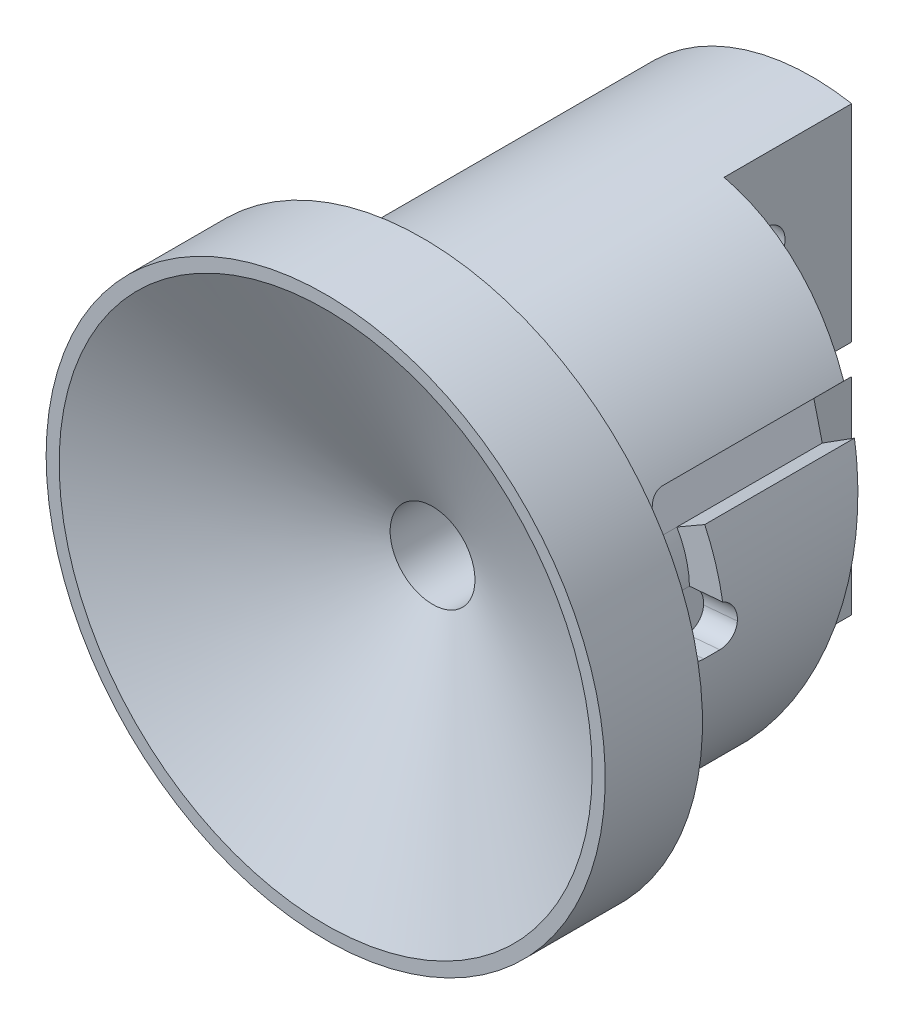
ISO-10303-21;
HEADER;
FILE_DESCRIPTION(('STEP AP214'),'2;1');
FILE_NAME('part.step','',(''),(''),'','','');
FILE_SCHEMA(('AUTOMOTIVE_DESIGN { 1 0 10303 214 1 1 1 1 }'));
ENDSEC;
DATA;
#1=APPLICATION_CONTEXT('core data for automotive mechanical design processes');
#2=APPLICATION_PROTOCOL_DEFINITION('international standard','automotive_design',2000,#1);
#3=PRODUCT_CONTEXT('',#1,'mechanical');
#4=PRODUCT('Part','Part','',(#3));
#5=PRODUCT_RELATED_PRODUCT_CATEGORY('part','',(#4));
#6=PRODUCT_DEFINITION_FORMATION('','',#4);
#7=PRODUCT_DEFINITION_CONTEXT('part definition',#1,'design');
#8=PRODUCT_DEFINITION('design','',#6,#7);
#9=PRODUCT_DEFINITION_SHAPE('','',#8);
#10=(LENGTH_UNIT() NAMED_UNIT(*) SI_UNIT(.MILLI.,.METRE.));
#11=(NAMED_UNIT(*) PLANE_ANGLE_UNIT() SI_UNIT($,.RADIAN.));
#12=(NAMED_UNIT(*) SI_UNIT($,.STERADIAN.) SOLID_ANGLE_UNIT());
#13=UNCERTAINTY_MEASURE_WITH_UNIT(LENGTH_MEASURE(1.E-05),#10,'distance_accuracy_value','');
#14=(GEOMETRIC_REPRESENTATION_CONTEXT(3) GLOBAL_UNCERTAINTY_ASSIGNED_CONTEXT((#13)) GLOBAL_UNIT_ASSIGNED_CONTEXT((#10,
#11,#12)) REPRESENTATION_CONTEXT('',''));
#15=CARTESIAN_POINT('',(0.,0.,0.));
#16=DIRECTION('',(0.,0.,1.));
#17=DIRECTION('',(1.,0.,0.));
#18=AXIS2_PLACEMENT_3D('',#15,#16,#17);
#19=CARTESIAN_POINT('',(12.4163792441114,1.08629242589841,-11.43));
#20=DIRECTION('',(-0.996194698091745,-0.0871557427476648,0.));
#21=DIRECTION('',(0.0871557427476648,-0.996194698091745,0.));
#22=AXIS2_PLACEMENT_3D('',#19,#20,#21);
#23=PLANE('',#22);
#24=DIRECTION('',(0.,0.,1.));
#25=VECTOR('',#24,1.);
#26=CARTESIAN_POINT('',(12.5303876711996,-0.216829858675404,-11.43));
#27=LINE('',#26,#25);
#28=CARTESIAN_POINT('',(12.5303876711996,-0.216829858675404,-11.0477431507776));
#29=VERTEX_POINT('',#28);
#30=CARTESIAN_POINT('',(12.5303876711996,-0.216829858675404,-10.0076));
#31=VERTEX_POINT('',#30);
#32=EDGE_CURVE('E184',#29,#31,#27,.T.);
#33=ORIENTED_EDGE('',*,*,#32,.F.);
#34=CARTESIAN_POINT('',(12.4263411455075,0.972427371906513,-11.0477431507776));
#35=DIRECTION('',(-0.996194698091745,-0.0871557427476648,0.));
#36=DIRECTION('',(0.0871557427476648,-0.996194698091745,0.));
#37=AXIS2_PLACEMENT_3D('',#34,#35,#36);
#38=CIRCLE('',#37,1.1938);
#39=CARTESIAN_POINT('',(12.4417284972035,0.796549137220463,-12.2284160588988));
#40=VERTEX_POINT('',#39);
#41=EDGE_CURVE('E60',#29,#40,#38,.F.);
#42=ORIENTED_EDGE('',*,*,#41,.T.);
#43=CARTESIAN_POINT('',(12.4248678884302,0.989266777355177,-10.9347));
#44=DIRECTION('',(0.996194698091745,0.0871557427476654,0.));
#45=DIRECTION('',(-0.0871557427476654,0.996194698091745,0.));
#46=AXIS2_PLACEMENT_3D('',#43,#44,#45);
#47=CIRCLE('',#46,1.3081);
#48=CARTESIAN_POINT('',(12.3193481056608,2.19536341338579,-11.43));
#49=VERTEX_POINT('',#48);
#50=EDGE_CURVE('E178',#40,#49,#47,.T.);
#51=ORIENTED_EDGE('',*,*,#50,.T.);
#52=DIRECTION('',(0.,0.,-1.));
#53=VECTOR('',#52,1.);
#54=CARTESIAN_POINT('',(12.3193481056608,2.19536341338579,-4.98224669027091));
#55=LINE('',#54,#53);
#56=CARTESIAN_POINT('',(12.3193481056608,2.19536341338579,-8.8138));
#57=VERTEX_POINT('',#56);
#58=EDGE_CURVE('E625',#57,#49,#55,.T.);
#59=ORIENTED_EDGE('',*,*,#58,.F.);
#60=DIRECTION('',(0.0871557427476648,-0.996194698091745,0.));
#61=VECTOR('',#60,1.);
#62=CARTESIAN_POINT('',(12.4163792441114,1.08629242589841,-8.8138));
#63=LINE('',#62,#61);
#64=CARTESIAN_POINT('',(12.4263411455075,0.972427371906522,-8.8138));
#65=VERTEX_POINT('',#64);
#66=EDGE_CURVE('E169',#57,#65,#63,.T.);
#67=ORIENTED_EDGE('',*,*,#66,.T.);
#68=CARTESIAN_POINT('',(12.4263411455075,0.972427371906522,-10.0076));
#69=DIRECTION('',(-0.996194698091745,-0.0871557427476648,0.));
#70=DIRECTION('',(0.0871557427476648,-0.996194698091745,0.));
#71=AXIS2_PLACEMENT_3D('',#68,#69,#70);
#72=CIRCLE('',#71,1.1938);
#73=EDGE_CURVE('E285',#65,#31,#72,.F.);
#74=ORIENTED_EDGE('',*,*,#73,.T.);
#75=EDGE_LOOP('',(#33,#42,#51,#59,#67,#74));
#76=FACE_BOUND('',#75,.T.);
#77=ADVANCED_FACE('F46',(#76),#23,.F.);
#78=CARTESIAN_POINT('',(0.,0.,-0.325495880631441));
#79=DIRECTION('',(0.,0.,-1.));
#80=DIRECTION('',(-1.,0.,0.));
#81=AXIS2_PLACEMENT_3D('',#78,#79,#80);
#82=CYLINDRICAL_SURFACE('',#81,14.6812);
#83=CARTESIAN_POINT('',(0.,0.,-6.35));
#84=DIRECTION('',(0.,0.,-1.));
#85=DIRECTION('',(-1.,0.,0.));
#86=AXIS2_PLACEMENT_3D('',#83,#84,#85);
#87=CIRCLE('',#86,14.6812);
#88=CARTESIAN_POINT('',(-14.6812,0.,-6.35));
#89=VERTEX_POINT('',#88);
#90=EDGE_CURVE('E246',#89,#89,#87,.T.);
#91=ORIENTED_EDGE('',*,*,#90,.T.);
#92=EDGE_LOOP('',(#91));
#93=FACE_BOUND('',#92,.T.);
#94=CARTESIAN_POINT('',(0.,0.,-11.43));
#95=DIRECTION('',(0.,0.,-1.));
#96=DIRECTION('',(-1.,0.,0.));
#97=AXIS2_PLACEMENT_3D('',#94,#95,#96);
#98=CIRCLE('',#97,14.6812);
#99=CARTESIAN_POINT('',(13.3177730257338,6.17855606715985,-11.43));
#100=VERTEX_POINT('',#99);
#101=CARTESIAN_POINT('',(14.4861901964781,2.3849375319831,-11.43));
#102=VERTEX_POINT('',#101);
#103=EDGE_CURVE('E174',#100,#102,#98,.T.);
#104=ORIENTED_EDGE('',*,*,#103,.T.);
#105=CARTESIAN_POINT('',(14.4861901964781,2.3849375319831,-11.43));
#106=CARTESIAN_POINT('',(14.4884613639518,2.37113892146036,-11.4640839324803));
#107=CARTESIAN_POINT('',(14.4909469978515,2.35592163119562,-11.4975599355647));
#108=CARTESIAN_POINT('',(14.4963016066078,2.32274827648895,-11.5630917175754));
#109=CARTESIAN_POINT('',(14.4991705585478,2.30479237576407,-11.5951475812514));
#110=CARTESIAN_POINT('',(14.5082748069592,2.24702314199613,-11.6887851744347));
#111=CARTESIAN_POINT('',(14.5150150036987,2.2032637948891,-11.7479464938295));
#112=CARTESIAN_POINT('',(14.5293750070234,2.10648592639315,-11.8580031221646));
#113=CARTESIAN_POINT('',(14.5369951813185,2.0534635295405,-11.9088949540572));
#114=CARTESIAN_POINT('',(14.5526203993969,1.93963040528132,-12.0009804680014));
#115=CARTESIAN_POINT('',(14.5606253725657,1.87882110346975,-12.0421759213184));
#116=CARTESIAN_POINT('',(14.576537633485,1.75109152865624,-12.1137040439891));
#117=CARTESIAN_POINT('',(14.5844449014716,1.68417004152981,-12.1440345492142));
#118=CARTESIAN_POINT('',(14.5997272511608,1.54609767566489,-12.1929541419579));
#119=CARTESIAN_POINT('',(14.607102277394,1.47494635750507,-12.2115420072372));
#120=CARTESIAN_POINT('',(14.6209501884581,1.33066995216013,-12.2363920347503));
#121=CARTESIAN_POINT('',(14.6274258299262,1.25755175459766,-12.2426926683214));
#122=CARTESIAN_POINT('',(14.6392703996066,1.11120858960278,-12.2429046032492));
#123=CARTESIAN_POINT('',(14.6446393414138,1.03798362349305,-12.2368160568067));
#124=CARTESIAN_POINT('',(14.6541548947385,0.893645242462607,-12.2124528028116));
#125=CARTESIAN_POINT('',(14.6583036793869,0.822528278854515,-12.1941999519649));
#126=CARTESIAN_POINT('',(14.6654071916949,0.684294374417719,-12.1460628447409));
#127=CARTESIAN_POINT('',(14.6683620518004,0.61717699060737,-12.1161798792521));
#128=CARTESIAN_POINT('',(14.6732064954826,0.488666124884252,-12.0455416585469));
#129=CARTESIAN_POINT('',(14.6750933912915,0.427287406482897,-12.0047593487301));
#130=CARTESIAN_POINT('',(14.6779937408499,0.312178358820198,-11.9135124207659));
#131=CARTESIAN_POINT('',(14.6790070080101,0.258449665492134,-11.8630457370473));
#132=CARTESIAN_POINT('',(14.6804218904452,0.159245895251082,-11.7527841678264));
#133=CARTESIAN_POINT('',(14.680811807414,0.113942466276904,-11.692833569748));
#134=CARTESIAN_POINT('',(14.6811136624675,0.0541648994216365,-11.5978162464266));
#135=CARTESIAN_POINT('',(14.6811670302523,0.0355888327049288,-11.5652633572206));
#136=CARTESIAN_POINT('',(14.6812098056202,0.00129355360213024,-11.498683736804));
#137=CARTESIAN_POINT('',(14.6811992098185,-0.014425507549017,-11.4646569276898));
#138=CARTESIAN_POINT('',(14.6811720243797,-0.028660610083196,-11.43));
#139=B_SPLINE_CURVE_WITH_KNOTS('',3,(#105,#106,#107,#108,#109,#110,#111,#112,#113,#114,#115,
#116,#117,#118,#119,#120,#121,#122,#123,#124,#125,#126,#127,#128,#129,#130,#131,#132,#133,#134,
#135,#136,#137,#138),.UNSPECIFIED.,.F.,.F.,(4,2,2,2,2,2,2,2,2,2,2,2,2,2,2,2,4),(0.,
0.110455309405497,0.22090401826105,0.441450437625067,0.662089350884358,0.882687928062333,
1.10333042064266,1.3239958751392,1.5439693094908,1.76394004148966,1.98351659398571,
2.20306878145643,2.42317109112525,2.64332039849976,2.86755466092752,2.97987594788759,
3.09220317881903),.UNSPECIFIED.);
#140=CARTESIAN_POINT('',(14.6478125129356,0.989556479382784,-12.2284160588988));
#141=VERTEX_POINT('',#140);
#142=EDGE_CURVE('E160',#102,#141,#139,.T.);
#143=ORIENTED_EDGE('',*,*,#142,.T.);
#144=CARTESIAN_POINT('',(14.6478125129356,0.989556479382784,-12.2284160588988));
#145=CARTESIAN_POINT('',(14.6500520617752,0.956414885802688,-12.2234497719461));
#146=CARTESIAN_POINT('',(14.6521625740862,0.923490699329103,-12.2170844377252));
#147=CARTESIAN_POINT('',(14.6561266797544,0.858282230564713,-12.2016024279582));
#148=CARTESIAN_POINT('',(14.6579802900503,0.825997906205256,-12.1924859339349));
#149=CARTESIAN_POINT('',(14.6631521672888,0.730511927722907,-12.1611134422584));
#150=CARTESIAN_POINT('',(14.6660889302212,0.668565530487546,-12.1348175692463));
#151=CARTESIAN_POINT('',(14.6710176288004,0.549922268249114,-12.0722187251337));
#152=CARTESIAN_POINT('',(14.6730091760995,0.493227568624937,-12.0359116505367));
#153=CARTESIAN_POINT('',(14.6762031903628,0.38669701296365,-11.9543239944428));
#154=CARTESIAN_POINT('',(14.6774058468479,0.336859511848389,-11.9090455716021));
#155=CARTESIAN_POINT('',(14.6792209558788,0.245374594432259,-11.8106954776694));
#156=CARTESIAN_POINT('',(14.6798323334249,0.203742204744798,-11.7576098133281));
#157=CARTESIAN_POINT('',(14.680671372986,0.129958071030313,-11.6451657160257));
#158=CARTESIAN_POINT('',(14.680898820731,0.0978116293300162,-11.5858037999342));
#159=CARTESIAN_POINT('',(14.6811588607807,0.043971541156054,-11.4625272929247));
#160=CARTESIAN_POINT('',(14.681191469244,0.0222770279981484,-11.3986130799922));
#161=CARTESIAN_POINT('',(14.6812059558936,-0.00998039306510226,-11.268137439148));
#162=CARTESIAN_POINT('',(14.6811879344012,-0.0205652571984908,-11.2015815034751));
#163=CARTESIAN_POINT('',(14.6811735472856,-0.0276040131707234,-11.1057329463568));
#164=CARTESIAN_POINT('',(14.6811706958382,-0.0286684031172335,-11.0767298307041));
#165=CARTESIAN_POINT('',(14.6811720243797,-0.0286606100832027,-11.0477431507776));
#166=B_SPLINE_CURVE_WITH_KNOTS('',3,(#144,#145,#146,#147,#148,#149,#150,#151,#152,#153,#154,
#155,#156,#157,#158,#159,#160,#161,#162,#163,#164,#165),.UNSPECIFIED.,.F.,.F.,(4,2,2,2,2,2,2,2,
2,2,4),(0.,0.100696848378733,0.201387054188759,0.402432056561508,0.603559588185072,
0.804638783804235,1.00608287651422,1.20763935734326,1.40917912203195,1.61031982519953,
1.69730434377564),.UNSPECIFIED.);
#167=CARTESIAN_POINT('',(14.6811720243797,-0.0286606100831969,-11.0477431507776));
#168=VERTEX_POINT('',#167);
#169=EDGE_CURVE('E13',#141,#168,#166,.T.);
#170=ORIENTED_EDGE('',*,*,#169,.T.);
#171=DIRECTION('',(0.,0.,1.));
#172=VECTOR('',#171,1.);
#173=CARTESIAN_POINT('',(14.6811720243797,-0.0286606100831969,-11.43));
#174=LINE('',#173,#172);
#175=CARTESIAN_POINT('',(14.6811720243797,-0.0286606100831969,-10.0076));
#176=VERTEX_POINT('',#175);
#177=EDGE_CURVE('E186',#168,#176,#174,.T.);
#178=ORIENTED_EDGE('',*,*,#177,.T.);
#179=CARTESIAN_POINT('',(14.6811720243797,-0.0286606100831969,-10.0076));
#180=CARTESIAN_POINT('',(14.6811713603819,-0.0286605230438289,-9.97408563546251));
#181=CARTESIAN_POINT('',(14.6811748663989,-0.0272427717737959,-9.94058738885749));
#182=CARTESIAN_POINT('',(14.6811845304353,-0.0215876829205685,-9.8738318693208));
#183=CARTESIAN_POINT('',(14.68119068829,-0.0173505205160749,-9.84057458154739));
#184=CARTESIAN_POINT('',(14.6812045930233,-0.000453664150254155,-9.74159048510479));
#185=CARTESIAN_POINT('',(14.6812078098013,0.0163915308899458,-9.67652869935269));
#186=CARTESIAN_POINT('',(14.6810908383812,0.0607567027563818,-9.55016116036319));
#187=CARTESIAN_POINT('',(14.6809705991541,0.0882810907647501,-9.48885697138397));
#188=CARTESIAN_POINT('',(14.6804363890432,0.153200837694031,-9.37172124193255));
#189=CARTESIAN_POINT('',(14.6800224525708,0.190595039879959,-9.31588906119583));
#190=CARTESIAN_POINT('',(14.6786972688968,0.274281353774743,-9.21113424513901));
#191=CARTESIAN_POINT('',(14.6777848159165,0.320594862330806,-9.16222872618486));
#192=CARTESIAN_POINT('',(14.6752549436024,0.42074894096606,-9.07284954191489));
#193=CARTESIAN_POINT('',(14.6736373854947,0.474590991341006,-9.03237753874161));
#194=CARTESIAN_POINT('',(14.6695155823306,0.588380160054187,-8.96094395595983));
#195=CARTESIAN_POINT('',(14.6670094195741,0.648340280904667,-8.93000321783209));
#196=CARTESIAN_POINT('',(14.6609910764105,0.772547009819359,-8.87865031721457));
#197=CARTESIAN_POINT('',(14.6574795068623,0.836790996991481,-8.85823178273492));
#198=CARTESIAN_POINT('',(14.6507889416689,0.945461627073592,-8.83354305630054));
#199=CARTESIAN_POINT('',(14.6479009496125,0.989221128629121,-8.82614487763141));
#200=CARTESIAN_POINT('',(14.6416949748365,1.07720193868941,-8.81627361018692));
#201=CARTESIAN_POINT('',(14.6383775752617,1.12142254745402,-8.81379391522364));
#202=CARTESIAN_POINT('',(14.6348522499863,1.16564705681955,-8.8138));
#203=B_SPLINE_CURVE_WITH_KNOTS('',3,(#179,#180,#181,#182,#183,#184,#185,#186,#187,#188,#189,
#190,#191,#192,#193,#194,#195,#196,#197,#198,#199,#200,#201,#202),.UNSPECIFIED.,.F.,.F.,(4,2,2,
2,2,2,2,2,2,2,2,4),(0.,0.10048113671173,0.200956030803738,0.401542288075423,0.602211488518851,
0.8028571811141,1.00399034458768,1.20516311152662,1.40677269924674,1.60826005322121,
1.74142420625145,1.87440938039694),.UNSPECIFIED.);
#204=CARTESIAN_POINT('',(14.6348522499863,1.16564705681955,-8.8138));
#205=VERTEX_POINT('',#204);
#206=EDGE_CURVE('E295',#176,#205,#203,.T.);
#207=ORIENTED_EDGE('',*,*,#206,.T.);
#208=CARTESIAN_POINT('',(0.,0.,-8.8138));
#209=DIRECTION('',(0.,0.,-1.));
#210=DIRECTION('',(-1.,0.,0.));
#211=AXIS2_PLACEMENT_3D('',#208,#209,#210);
#212=CIRCLE('',#211,14.6812);
#213=CARTESIAN_POINT('',(12.6567568233372,7.43936423055812,-8.8138));
#214=VERTEX_POINT('',#213);
#215=EDGE_CURVE('E198',#205,#214,#212,.F.);
#216=ORIENTED_EDGE('',*,*,#215,.T.);
#217=CARTESIAN_POINT('',(12.6567568233372,7.43936423055812,-8.8138));
#218=CARTESIAN_POINT('',(12.6397597788737,7.46828295212252,-8.81380015810687));
#219=CARTESIAN_POINT('',(12.6226705774063,7.49712876306233,-8.8152145949507));
#220=CARTESIAN_POINT('',(12.5884195945533,7.55449792981282,-8.82085647503839));
#221=CARTESIAN_POINT('',(12.5712578177808,7.58302130570696,-8.82508374208702));
#222=CARTESIAN_POINT('',(12.5198894231226,7.66774696235313,-8.84194156904666));
#223=CARTESIAN_POINT('',(12.4857380361821,7.72320965707814,-8.8587482841184));
#224=CARTESIAN_POINT('',(12.4187154652752,7.83052717895543,-8.90302146476721));
#225=CARTESIAN_POINT('',(12.3858448136072,7.88238051288315,-8.93049231164126));
#226=CARTESIAN_POINT('',(12.322454656725,7.98111440689049,-8.99530765608452));
#227=CARTESIAN_POINT('',(12.2919348705147,8.02799556154164,-9.03265097123783));
#228=CARTESIAN_POINT('',(12.2342228425561,8.11567569488978,-9.11625205562751));
#229=CARTESIAN_POINT('',(12.2070382409144,8.15646075385226,-9.16252968986431));
#230=CARTESIAN_POINT('',(12.1570375594092,8.23080088923721,-9.26265484131266));
#231=CARTESIAN_POINT('',(12.1342223196209,8.26435457547542,-9.31650381078207));
#232=CARTESIAN_POINT('',(12.0937823150095,8.32342180353166,-9.43031977384777));
#233=CARTESIAN_POINT('',(12.0761645636817,8.34892448453775,-9.49029488857362));
#234=CARTESIAN_POINT('',(12.0468408632733,8.39118133972652,-9.61459598954198));
#235=CARTESIAN_POINT('',(12.0351312922353,8.40794087403206,-9.6789192826759));
#236=CARTESIAN_POINT('',(12.0209857473769,8.4281451550881,-9.7876294569824));
#237=CARTESIAN_POINT('',(12.0167485960115,8.43418213385462,-9.83132608869502));
#238=CARTESIAN_POINT('',(12.0110913581152,8.44223457874028,-9.91920886554014));
#239=CARTESIAN_POINT('',(12.0096674778834,8.44425546059445,-9.96339427054197));
#240=CARTESIAN_POINT('',(12.0096730257338,8.4442517285407,-10.0076));
#241=B_SPLINE_CURVE_WITH_KNOTS('',3,(#217,#218,#219,#220,#221,#222,#223,#224,#225,#226,#227,
#228,#229,#230,#231,#232,#233,#234,#235,#236,#237,#238,#239,#240),.UNSPECIFIED.,.F.,.F.,(4,2,2,
2,2,2,2,2,2,2,2,4),(0.,0.100569590039991,0.201132881010322,0.401899054356789,0.60274779877107,
0.80357249861645,1.00484897434578,1.20616410971808,1.40774967022183,1.6092114998785,
1.74189925108982,1.87440795018741),.UNSPECIFIED.);
#242=CARTESIAN_POINT('',(12.0096730257338,8.4442517285407,-10.0076));
#243=VERTEX_POINT('',#242);
#244=EDGE_CURVE('E288',#214,#243,#241,.T.);
#245=ORIENTED_EDGE('',*,*,#244,.T.);
#246=DIRECTION('',(0.,0.,-1.));
#247=VECTOR('',#246,1.);
#248=CARTESIAN_POINT('',(12.0096730257338,8.4442517285407,-1.79195968761566));
#249=LINE('',#248,#247);
#250=CARTESIAN_POINT('',(12.0096730257338,8.4442517285407,-21.8093523907729));
#251=VERTEX_POINT('',#250);
#252=EDGE_CURVE('E199',#243,#251,#249,.T.);
#253=ORIENTED_EDGE('',*,*,#252,.T.);
#254=CARTESIAN_POINT('',(0.,0.,-19.5467219594253));
#255=DIRECTION('',(0.,0.258819045102522,0.965925826289068));
#256=DIRECTION('',(0.,0.965925826289068,-0.258819045102522));
#257=AXIS2_PLACEMENT_3D('',#254,#255,#256);
#258=ELLIPSE('',#257,15.1990966598365,14.6812);
#259=CARTESIAN_POINT('',(2.5908,14.4507919782966,-23.4188));
#260=VERTEX_POINT('',#259);
#261=EDGE_CURVE('E258',#260,#251,#258,.F.);
#262=ORIENTED_EDGE('',*,*,#261,.F.);
#263=DIRECTION('',(0.,0.,-1.));
#264=VECTOR('',#263,1.);
#265=CARTESIAN_POINT('',(2.5908,14.4507919782966,-23.4188));
#266=LINE('',#265,#264);
#267=CARTESIAN_POINT('',(2.5908,14.4507919782966,-31.75));
#268=VERTEX_POINT('',#267);
#269=EDGE_CURVE('E221',#260,#268,#266,.T.);
#270=ORIENTED_EDGE('',*,*,#269,.T.);
#271=CARTESIAN_POINT('',(0.,0.,-31.75));
#272=DIRECTION('',(0.,0.,-1.));
#273=DIRECTION('',(-1.,0.,0.));
#274=AXIS2_PLACEMENT_3D('',#271,#272,#273);
#275=CIRCLE('',#274,14.6812);
#276=CARTESIAN_POINT('',(2.5908,-14.4507919782966,-31.75));
#277=VERTEX_POINT('',#276);
#278=EDGE_CURVE('E249',#277,#268,#275,.T.);
#279=ORIENTED_EDGE('',*,*,#278,.F.);
#280=DIRECTION('',(0.,0.,1.));
#281=VECTOR('',#280,1.);
#282=CARTESIAN_POINT('',(2.5908,-14.4507919782966,-31.75));
#283=LINE('',#282,#281);
#284=CARTESIAN_POINT('',(2.5908,-14.4507919782966,-15.6746439188506));
#285=VERTEX_POINT('',#284);
#286=EDGE_CURVE('E214',#277,#285,#283,.T.);
#287=ORIENTED_EDGE('',*,*,#286,.T.);
#288=CARTESIAN_POINT('',(13.3177730257338,6.17855606715985,-21.2022610680112));
#289=VERTEX_POINT('',#288);
#290=EDGE_CURVE('E255',#289,#285,#258,.F.);
#291=ORIENTED_EDGE('',*,*,#290,.F.);
#292=DIRECTION('',(0.,0.,-1.));
#293=VECTOR('',#292,1.);
#294=CARTESIAN_POINT('',(13.3177730257338,6.17855606715985,-1.79195968761566));
#295=LINE('',#294,#293);
#296=EDGE_CURVE('E183',#100,#289,#295,.T.);
#297=ORIENTED_EDGE('',*,*,#296,.F.);
#298=EDGE_LOOP('',(#104,#143,#170,#178,#207,#216,#245,#253,#262,#270,#279,#287,#291,#297));
#299=FACE_BOUND('',#298,.T.);
#300=ADVANCED_FACE('F181',(#93,#299),#82,.T.);
#301=CARTESIAN_POINT('',(0.,0.,-11.43));
#302=DIRECTION('',(0.,0.,-1.));
#303=DIRECTION('',(-1.,0.,0.));
#304=AXIS2_PLACEMENT_3D('',#301,#302,#303);
#305=PLANE('',#304);
#306=CARTESIAN_POINT('',(6.18343536424458,2.05954429780938,-11.43));
#307=DIRECTION('',(0.,0.,1.));
#308=DIRECTION('',(1.,0.,0.));
#309=AXIS2_PLACEMENT_3D('',#306,#307,#308);
#310=CIRCLE('',#309,6.13741574300042);
#311=CARTESIAN_POINT('',(11.4985933112695,5.12825216930959,-11.43));
#312=VERTEX_POINT('',#311);
#313=EDGE_CURVE('E177',#49,#312,#310,.T.);
#314=ORIENTED_EDGE('',*,*,#313,.F.);
#315=DIRECTION('',(-0.996194698091745,-0.0871557427476654,0.));
#316=VECTOR('',#315,1.);
#317=CARTESIAN_POINT('',(19.5987713062001,2.8322304204406,-11.43));
#318=LINE('',#317,#316);
#319=EDGE_CURVE('E164',#102,#49,#318,.T.);
#320=ORIENTED_EDGE('',*,*,#319,.F.);
#321=ORIENTED_EDGE('',*,*,#103,.F.);
#322=DIRECTION('',(0.866025403784438,0.500000000000001,0.));
#323=VECTOR('',#322,1.);
#324=CARTESIAN_POINT('',(13.3177730257338,6.17855606715985,-11.43));
#325=LINE('',#324,#323);
#326=EDGE_CURVE('E270',#312,#100,#325,.T.);
#327=ORIENTED_EDGE('',*,*,#326,.F.);
#328=EDGE_LOOP('',(#314,#320,#321,#327));
#329=FACE_BOUND('',#328,.T.);
#330=ADVANCED_FACE('F173',(#329),#305,.F.);
#331=CARTESIAN_POINT('',(0.,0.,-0.325495880631441));
#332=DIRECTION('',(0.,0.,-1.));
#333=DIRECTION('',(-1.,0.,0.));
#334=AXIS2_PLACEMENT_3D('',#331,#332,#333);
#335=CYLINDRICAL_SURFACE('',#334,2.7686);
#336=CARTESIAN_POINT('',(0.,0.,-6.97773967883212));
#337=DIRECTION('',(0.,0.,1.));
#338=DIRECTION('',(1.,0.,0.));
#339=AXIS2_PLACEMENT_3D('',#336,#337,#338);
#340=CIRCLE('',#339,2.7686);
#341=CARTESIAN_POINT('',(2.7686,0.,-6.97773967883212));
#342=VERTEX_POINT('',#341);
#343=EDGE_CURVE('E239',#342,#342,#340,.F.);
#344=ORIENTED_EDGE('',*,*,#343,.F.);
#345=EDGE_LOOP('',(#344));
#346=FACE_BOUND('',#345,.T.);
#347=CARTESIAN_POINT('',(0.,0.,-19.5467219594253));
#348=DIRECTION('',(0.,0.258819045102522,0.965925826289068));
#349=DIRECTION('',(0.,0.965925826289068,-0.258819045102522));
#350=AXIS2_PLACEMENT_3D('',#347,#348,#349);
#351=ELLIPSE('',#350,2.86626563308336,2.7686);
#352=CARTESIAN_POINT('',(2.5908,-0.976166645609243,-19.2851588950561));
#353=VERTEX_POINT('',#352);
#354=CARTESIAN_POINT('',(2.5908,0.976166645609244,-19.8082850237945));
#355=VERTEX_POINT('',#354);
#356=EDGE_CURVE('E234',#353,#355,#351,.T.);
#357=ORIENTED_EDGE('',*,*,#356,.F.);
#358=DIRECTION('',(0.,0.,-1.));
#359=VECTOR('',#358,1.);
#360=CARTESIAN_POINT('',(2.5908,-0.976166645609243,-0.325495880631441));
#361=LINE('',#360,#359);
#362=CARTESIAN_POINT('',(2.5908,-0.976166645609244,-31.75));
#363=VERTEX_POINT('',#362);
#364=EDGE_CURVE('E231',#353,#363,#361,.T.);
#365=ORIENTED_EDGE('',*,*,#364,.T.);
#366=CARTESIAN_POINT('',(0.,0.,-31.75));
#367=DIRECTION('',(0.,0.,-1.));
#368=DIRECTION('',(-1.,0.,0.));
#369=AXIS2_PLACEMENT_3D('',#366,#367,#368);
#370=CIRCLE('',#369,2.7686);
#371=CARTESIAN_POINT('',(2.5908,0.976166645609244,-31.75));
#372=VERTEX_POINT('',#371);
#373=EDGE_CURVE('E252',#363,#372,#370,.T.);
#374=ORIENTED_EDGE('',*,*,#373,.T.);
#375=DIRECTION('',(0.,0.,-1.));
#376=VECTOR('',#375,1.);
#377=CARTESIAN_POINT('',(2.5908,0.976166645609243,-0.325495880631441));
#378=LINE('',#377,#376);
#379=EDGE_CURVE('E228',#372,#355,#378,.F.);
#380=ORIENTED_EDGE('',*,*,#379,.T.);
#381=EDGE_LOOP('',(#357,#365,#374,#380));
#382=FACE_BOUND('',#381,.T.);
#383=ADVANCED_FACE('F318',(#346,#382),#335,.F.);
#384=CARTESIAN_POINT('',(0.,2.7686,-31.75));
#385=DIRECTION('',(0.,0.,-1.));
#386=DIRECTION('',(-1.,0.,0.));
#387=AXIS2_PLACEMENT_3D('',#384,#385,#386);
#388=PLANE('',#387);
#389=ORIENTED_EDGE('',*,*,#278,.T.);
#390=DIRECTION('',(0.,-1.,0.));
#391=VECTOR('',#390,1.);
#392=CARTESIAN_POINT('',(2.5908,14.4507919782966,-31.75));
#393=LINE('',#392,#391);
#394=EDGE_CURVE('E225',#268,#372,#393,.T.);
#395=ORIENTED_EDGE('',*,*,#394,.T.);
#396=ORIENTED_EDGE('',*,*,#373,.F.);
#397=EDGE_CURVE('E224',#363,#277,#393,.T.);
#398=ORIENTED_EDGE('',*,*,#397,.T.);
#399=EDGE_LOOP('',(#389,#395,#396,#398));
#400=FACE_BOUND('',#399,.T.);
#401=ADVANCED_FACE('F311',(#400),#388,.T.);
#402=CARTESIAN_POINT('',(0.,18.2499,0.));
#403=DIRECTION('',(0.,0.,1.));
#404=DIRECTION('',(1.,0.,0.));
#405=AXIS2_PLACEMENT_3D('',#402,#403,#404);
#406=PLANE('',#405);
#407=CARTESIAN_POINT('',(0.,0.,0.));
#408=DIRECTION('',(0.,0.,-1.));
#409=DIRECTION('',(-1.,0.,0.));
#410=AXIS2_PLACEMENT_3D('',#407,#408,#409);
#411=CIRCLE('',#410,17.399);
#412=CARTESIAN_POINT('',(17.399,0.,0.));
#413=VERTEX_POINT('',#412);
#414=EDGE_CURVE('E236',#413,#413,#411,.T.);
#415=ORIENTED_EDGE('',*,*,#414,.T.);
#416=EDGE_LOOP('',(#415));
#417=FACE_BOUND('',#416,.T.);
#418=CARTESIAN_POINT('',(0.,0.,0.));
#419=DIRECTION('',(0.,0.,-1.));
#420=DIRECTION('',(-1.,0.,0.));
#421=AXIS2_PLACEMENT_3D('',#418,#419,#420);
#422=CIRCLE('',#421,18.2499);
#423=CARTESIAN_POINT('',(-18.2499,0.,0.));
#424=VERTEX_POINT('',#423);
#425=EDGE_CURVE('E240',#424,#424,#422,.T.);
#426=ORIENTED_EDGE('',*,*,#425,.F.);
#427=EDGE_LOOP('',(#426));
#428=FACE_BOUND('',#427,.T.);
#429=ADVANCED_FACE('F317',(#417,#428),#406,.T.);
#430=CARTESIAN_POINT('',(0.,14.6812,-6.35));
#431=DIRECTION('',(0.,0.,-1.));
#432=DIRECTION('',(-1.,0.,0.));
#433=AXIS2_PLACEMENT_3D('',#430,#431,#432);
#434=PLANE('',#433);
#435=CARTESIAN_POINT('',(0.,0.,-6.35));
#436=DIRECTION('',(0.,0.,-1.));
#437=DIRECTION('',(-1.,0.,0.));
#438=AXIS2_PLACEMENT_3D('',#435,#436,#437);
#439=CIRCLE('',#438,18.2499);
#440=CARTESIAN_POINT('',(-18.2499,0.,-6.35));
#441=VERTEX_POINT('',#440);
#442=EDGE_CURVE('E243',#441,#441,#439,.T.);
#443=ORIENTED_EDGE('',*,*,#442,.T.);
#444=EDGE_LOOP('',(#443));
#445=FACE_BOUND('',#444,.T.);
#446=ORIENTED_EDGE('',*,*,#90,.F.);
#447=EDGE_LOOP('',(#446));
#448=FACE_BOUND('',#447,.T.);
#449=ADVANCED_FACE('F309',(#445,#448),#434,.T.);
#450=CARTESIAN_POINT('',(0.,0.,-0.325495880631441));
#451=DIRECTION('',(0.,0.,-1.));
#452=DIRECTION('',(-1.,0.,0.));
#453=AXIS2_PLACEMENT_3D('',#450,#451,#452);
#454=CYLINDRICAL_SURFACE('',#453,18.2499);
#455=ORIENTED_EDGE('',*,*,#425,.T.);
#456=EDGE_LOOP('',(#455));
#457=FACE_BOUND('',#456,.T.);
#458=ORIENTED_EDGE('',*,*,#442,.F.);
#459=EDGE_LOOP('',(#458));
#460=FACE_BOUND('',#459,.T.);
#461=ADVANCED_FACE('F327',(#457,#460),#454,.T.);
#462=CARTESIAN_POINT('',(0.,0.,-8.29818));
#463=DIRECTION('',(0.,0.,1.));
#464=DIRECTION('',(1.,0.,0.));
#465=AXIS2_PLACEMENT_3D('',#462,#463,#464);
#466=CONICAL_SURFACE('',#465,0.,1.12577095336052);
#467=CARTESIAN_POINT('',(2.7686,0.,-6.97773967883212));
#468=CARTESIAN_POINT('',(2.921,0.,-6.90505489051095));
#469=CARTESIAN_POINT('',(3.0734,0.,-6.83237010218978));
#470=CARTESIAN_POINT('',(3.3782,0.,-6.68700052554744));
#471=CARTESIAN_POINT('',(3.5306,0.,-6.61431573722628));
#472=CARTESIAN_POINT('',(3.8354,0.,-6.46894616058394));
#473=CARTESIAN_POINT('',(3.9878,0.,-6.39626137226277));
#474=CARTESIAN_POINT('',(4.2926,0.,-6.25089179562044));
#475=CARTESIAN_POINT('',(4.445,0.,-6.17820700729927));
#476=CARTESIAN_POINT('',(4.7498,0.,-6.03283743065693));
#477=CARTESIAN_POINT('',(4.9022,0.,-5.96015264233577));
#478=CARTESIAN_POINT('',(5.207,0.,-5.81478306569343));
#479=CARTESIAN_POINT('',(5.3594,0.,-5.74209827737226));
#480=CARTESIAN_POINT('',(5.6642,0.,-5.59672870072993));
#481=CARTESIAN_POINT('',(5.8166,0.,-5.52404391240876));
#482=CARTESIAN_POINT('',(6.1214,0.,-5.37867433576642));
#483=CARTESIAN_POINT('',(6.2738,0.,-5.30598954744526));
#484=CARTESIAN_POINT('',(6.5786,0.,-5.16061997080292));
#485=CARTESIAN_POINT('',(6.731,0.,-5.08793518248175));
#486=CARTESIAN_POINT('',(7.0358,0.,-4.94256560583942));
#487=CARTESIAN_POINT('',(7.1882,0.,-4.86988081751825));
#488=CARTESIAN_POINT('',(7.493,0.,-4.72451124087591));
#489=CARTESIAN_POINT('',(7.6454,0.,-4.65182645255474));
#490=CARTESIAN_POINT('',(7.9502,0.,-4.50645687591241));
#491=CARTESIAN_POINT('',(8.1026,0.,-4.43377208759124));
#492=CARTESIAN_POINT('',(8.4074,0.,-4.28840251094891));
#493=CARTESIAN_POINT('',(8.5598,0.,-4.21571772262774));
#494=CARTESIAN_POINT('',(8.8646,0.,-4.0703481459854));
#495=CARTESIAN_POINT('',(9.017,0.,-3.99766335766423));
#496=CARTESIAN_POINT('',(9.3218,0.,-3.8522937810219));
#497=CARTESIAN_POINT('',(9.4742,0.,-3.77960899270073));
#498=CARTESIAN_POINT('',(9.779,0.,-3.63423941605839));
#499=CARTESIAN_POINT('',(9.9314,0.,-3.56155462773723));
#500=CARTESIAN_POINT('',(10.2362,0.,-3.41618505109489));
#501=CARTESIAN_POINT('',(10.3886,0.,-3.34350026277372));
#502=CARTESIAN_POINT('',(10.6934,0.,-3.19813068613139));
#503=CARTESIAN_POINT('',(10.8458,0.,-3.12544589781022));
#504=CARTESIAN_POINT('',(11.1506,0.,-2.98007632116788));
#505=CARTESIAN_POINT('',(11.303,0.,-2.90739153284672));
#506=CARTESIAN_POINT('',(11.6078,0.,-2.76202195620438));
#507=CARTESIAN_POINT('',(11.7602,0.,-2.68933716788321));
#508=CARTESIAN_POINT('',(12.065,0.,-2.54396759124088));
#509=CARTESIAN_POINT('',(12.2174,0.,-2.47128280291971));
#510=CARTESIAN_POINT('',(12.5222,0.,-2.32591322627737));
#511=CARTESIAN_POINT('',(12.6746,0.,-2.2532284379562));
#512=CARTESIAN_POINT('',(12.9794,0.,-2.10785886131387));
#513=CARTESIAN_POINT('',(13.1318,0.,-2.0351740729927));
#514=CARTESIAN_POINT('',(13.4366,0.,-1.88980449635036));
#515=CARTESIAN_POINT('',(13.589,0.,-1.8171197080292));
#516=CARTESIAN_POINT('',(13.8938,0.,-1.67175013138686));
#517=CARTESIAN_POINT('',(14.0462,0.,-1.59906534306569));
#518=CARTESIAN_POINT('',(14.351,0.,-1.45369576642336));
#519=CARTESIAN_POINT('',(14.5034,0.,-1.38101097810219));
#520=CARTESIAN_POINT('',(14.8082,0.,-1.23564140145985));
#521=CARTESIAN_POINT('',(14.9606,0.,-1.16295661313869));
#522=CARTESIAN_POINT('',(15.2654,0.,-1.01758703649635));
#523=CARTESIAN_POINT('',(15.4178,0.,-0.944902248175182));
#524=CARTESIAN_POINT('',(15.7226,0.,-0.799532671532846));
#525=CARTESIAN_POINT('',(15.875,0.,-0.726847883211679));
#526=CARTESIAN_POINT('',(16.1798,0.,-0.581478306569343));
#527=CARTESIAN_POINT('',(16.3322,0.,-0.508793518248175));
#528=CARTESIAN_POINT('',(16.637,0.,-0.363423941605839));
#529=CARTESIAN_POINT('',(16.7894,0.,-0.290739153284672));
#530=CARTESIAN_POINT('',(17.0942,0.,-0.145369576642336));
#531=CARTESIAN_POINT('',(17.2466,0.,-0.0726847883211678));
#532=CARTESIAN_POINT('',(17.399,0.,0.));
#533=B_SPLINE_CURVE_WITH_KNOTS('',3,(#467,#468,#469,#470,#471,#472,#473,#474,#475,#476,#477,
#478,#479,#480,#481,#482,#483,#484,#485,#486,#487,#488,#489,#490,#491,#492,#493,#494,#495,#496,
#497,#498,#499,#500,#501,#502,#503,#504,#505,#506,#507,#508,#509,#510,#511,#512,#513,#514,#515,
#516,#517,#518,#519,#520,#521,#522,#523,#524,#525,#526,#527,#528,#529,#530,#531,#532),
.UNSPECIFIED.,.F.,.F.,(4,2,2,2,2,2,2,2,2,2,2,2,2,2,2,2,2,2,2,2,2,2,2,2,2,2,2,2,2,2,2,2,4),(0.,
0.506536816114718,1.01307363222944,1.51961044834416,2.02614726445888,2.5326840805736,
3.03922089668831,3.54575771280303,4.05229452891775,4.55883134503247,5.06536816114719,
5.57190497726191,6.07844179337663,6.58497860949135,7.09151542560607,7.59805224172079,
8.10458905783551,8.61112587395022,9.11766269006494,9.62419950617966,10.1307363222944,
10.6372731384091,11.1438099545238,11.6503467706385,12.1568835867533,12.663420402868,
13.1699572189827,13.6764940350974,14.1830308512121,14.6895676673269,15.1961044834416,
15.7026412995563,16.209178115671),.UNSPECIFIED.);
#534=EDGE_CURVE('BSEAM373',#342,#413,#533,.T.);
#535=ORIENTED_EDGE('',*,*,#343,.T.);
#536=ORIENTED_EDGE('',*,*,#414,.F.);
#537=ORIENTED_EDGE('',*,*,#534,.T.);
#538=ORIENTED_EDGE('',*,*,#534,.F.);
#539=EDGE_LOOP('',(#535,#537,#536,#538));
#540=FACE_BOUND('',#539,.T.);
#541=ADVANCED_FACE('F373',(#540),#466,.F.);
#542=CARTESIAN_POINT('',(2.5908,0.,0.));
#543=DIRECTION('',(1.,0.,0.));
#544=DIRECTION('',(0.,0.,-1.));
#545=AXIS2_PLACEMENT_3D('',#542,#543,#544);
#546=PLANE('',#545);
#547=DIRECTION('',(0.,0.965925826289068,-0.258819045102522));
#548=VECTOR('',#547,1.);
#549=CARTESIAN_POINT('',(2.5908,14.4507919782966,-23.4188));
#550=LINE('',#549,#548);
#551=EDGE_CURVE('E218',#285,#353,#550,.T.);
#552=ORIENTED_EDGE('',*,*,#551,.F.);
#553=ORIENTED_EDGE('',*,*,#286,.F.);
#554=ORIENTED_EDGE('',*,*,#397,.F.);
#555=ORIENTED_EDGE('',*,*,#364,.F.);
#556=EDGE_LOOP('',(#552,#553,#554,#555));
#557=FACE_BOUND('',#556,.T.);
#558=ADVANCED_FACE('F369',(#557),#546,.T.);
#559=CARTESIAN_POINT('',(18.2499,14.4507919782966,-23.4188));
#560=DIRECTION('',(0.,0.258819045102522,0.965925826289068));
#561=DIRECTION('',(0.,-0.965925826289068,0.258819045102522));
#562=AXIS2_PLACEMENT_3D('',#559,#560,#561);
#563=PLANE('',#562);
#564=ORIENTED_EDGE('',*,*,#261,.T.);
#565=DIRECTION('',(-0.858356263574048,-0.49557221983508,0.132788176096109));
#566=VECTOR('',#565,1.);
#567=CARTESIAN_POINT('',(19.3458105437235,12.6797726993642,-22.9442568144301));
#568=LINE('',#567,#566);
#569=CARTESIAN_POINT('',(10.1904933112695,7.39394783069043,-21.5279243095366));
#570=VERTEX_POINT('',#569);
#571=EDGE_CURVE('E267',#251,#570,#568,.T.);
#572=ORIENTED_EDGE('',*,*,#571,.T.);
#573=DIRECTION('',(0.487058473848149,-0.84361002296195,0.226044624379456));
#574=VECTOR('',#573,1.);
#575=CARTESIAN_POINT('',(8.9946457127643,9.46521662941064,-22.0829191114615));
#576=LINE('',#575,#574);
#577=CARTESIAN_POINT('',(11.4985933112695,5.12825216930959,-20.9208329867749));
#578=VERTEX_POINT('',#577);
#579=EDGE_CURVE('E264',#570,#578,#576,.T.);
#580=ORIENTED_EDGE('',*,*,#579,.T.);
#581=DIRECTION('',(0.858356263574048,0.495572219835079,-0.132788176096109));
#582=VECTOR('',#581,1.);
#583=CARTESIAN_POINT('',(20.7231065471991,10.4540273692168,-22.3478701506598));
#584=LINE('',#583,#582);
#585=EDGE_CURVE('E261',#578,#289,#584,.T.);
#586=ORIENTED_EDGE('',*,*,#585,.T.);
#587=ORIENTED_EDGE('',*,*,#290,.T.);
#588=ORIENTED_EDGE('',*,*,#551,.T.);
#589=ORIENTED_EDGE('',*,*,#356,.T.);
#590=EDGE_CURVE('E217',#355,#260,#550,.T.);
#591=ORIENTED_EDGE('',*,*,#590,.T.);
#592=EDGE_LOOP('',(#564,#572,#580,#586,#587,#588,#589,#591));
#593=FACE_BOUND('',#592,.T.);
#594=ADVANCED_FACE('F367',(#593),#563,.F.);
#595=CARTESIAN_POINT('',(2.5908,8.9408,-26.0445804363704));
#596=DIRECTION('',(1.,0.,0.));
#597=DIRECTION('',(0.,0.,-1.));
#598=AXIS2_PLACEMENT_3D('',#595,#596,#597);
#599=CIRCLE('',#598,1.35255);
#600=CARTESIAN_POINT('',(2.5908,8.9408,-27.3971304363704));
#601=VERTEX_POINT('',#600);
#602=EDGE_CURVE('E202',#601,#601,#599,.T.);
#603=ORIENTED_EDGE('',*,*,#602,.F.);
#604=EDGE_LOOP('',(#603));
#605=FACE_BOUND('',#604,.T.);
#606=ORIENTED_EDGE('',*,*,#394,.F.);
#607=ORIENTED_EDGE('',*,*,#269,.F.);
#608=ORIENTED_EDGE('',*,*,#590,.F.);
#609=ORIENTED_EDGE('',*,*,#379,.F.);
#610=EDGE_LOOP('',(#606,#607,#608,#609));
#611=FACE_BOUND('',#610,.T.);
#612=ADVANCED_FACE('F363',(#605,#611),#546,.T.);
#613=CARTESIAN_POINT('',(-8.382,8.9408,-26.0445804363704));
#614=DIRECTION('',(1.,0.,0.));
#615=DIRECTION('',(0.,0.,-1.));
#616=AXIS2_PLACEMENT_3D('',#613,#614,#615);
#617=CONICAL_SURFACE('',#616,1.35255,1.02974425867665);
#618=CARTESIAN_POINT('',(-9.19469403026573,8.9408,-26.0445804363704));
#619=VERTEX_POINT('',#618);
#620=VERTEX_LOOP('',#619);
#621=FACE_BOUND('',#620,.T.);
#622=CARTESIAN_POINT('',(-8.382,8.9408,-26.0445804363704));
#623=DIRECTION('',(1.,0.,0.));
#624=DIRECTION('',(0.,0.,-1.));
#625=AXIS2_PLACEMENT_3D('',#622,#623,#624);
#626=CIRCLE('',#625,1.35255);
#627=CARTESIAN_POINT('',(-8.382,8.9408,-27.3971304363704));
#628=VERTEX_POINT('',#627);
#629=EDGE_CURVE('E211',#628,#628,#626,.T.);
#630=ORIENTED_EDGE('',*,*,#629,.T.);
#631=EDGE_LOOP('',(#630));
#632=FACE_BOUND('',#631,.T.);
#633=ADVANCED_FACE('F359',(#621,#632),#617,.F.);
#634=CARTESIAN_POINT('',(2.5908,8.9408,-26.0445804363704));
#635=DIRECTION('',(1.,0.,0.));
#636=DIRECTION('',(0.,0.,-1.));
#637=AXIS2_PLACEMENT_3D('',#634,#635,#636);
#638=CYLINDRICAL_SURFACE('',#637,1.35255);
#639=ORIENTED_EDGE('',*,*,#629,.F.);
#640=EDGE_LOOP('',(#639));
#641=FACE_BOUND('',#640,.T.);
#642=ORIENTED_EDGE('',*,*,#602,.T.);
#643=EDGE_LOOP('',(#642));
#644=FACE_BOUND('',#643,.T.);
#645=ADVANCED_FACE('F349',(#641,#644),#638,.F.);
#646=CARTESIAN_POINT('',(10.1904933112695,7.39394783069043,-1.79195968761566));
#647=DIRECTION('',(-0.500000000000001,0.866025403784438,0.));
#648=DIRECTION('',(-0.866025403784438,-0.500000000000001,0.));
#649=AXIS2_PLACEMENT_3D('',#646,#647,#648);
#650=PLANE('',#649);
#651=ORIENTED_EDGE('',*,*,#252,.F.);
#652=DIRECTION('',(-0.866025403784438,-0.500000000000001,0.));
#653=VECTOR('',#652,1.);
#654=CARTESIAN_POINT('',(10.1904933112695,7.39394783069043,-10.0076));
#655=LINE('',#654,#653);
#656=CARTESIAN_POINT('',(10.1904933112695,7.39394783069043,-10.0076));
#657=VERTEX_POINT('',#656);
#658=EDGE_CURVE('E272',#243,#657,#655,.T.);
#659=ORIENTED_EDGE('',*,*,#658,.T.);
#660=DIRECTION('',(0.,0.,-1.));
#661=VECTOR('',#660,1.);
#662=CARTESIAN_POINT('',(10.1904933112695,7.39394783069043,-1.79195968761566));
#663=LINE('',#662,#661);
#664=EDGE_CURVE('E204',#657,#570,#663,.T.);
#665=ORIENTED_EDGE('',*,*,#664,.T.);
#666=ORIENTED_EDGE('',*,*,#571,.F.);
#667=EDGE_LOOP('',(#651,#659,#665,#666));
#668=FACE_BOUND('',#667,.T.);
#669=ADVANCED_FACE('F345',(#668),#650,.F.);
#670=CARTESIAN_POINT('',(11.4985933112695,5.12825216930959,-1.79195968761566));
#671=DIRECTION('',(-0.866025403784438,-0.500000000000001,0.));
#672=DIRECTION('',(0.500000000000001,-0.866025403784438,0.));
#673=AXIS2_PLACEMENT_3D('',#670,#671,#672);
#674=PLANE('',#673);
#675=DIRECTION('',(0.,0.,-1.));
#676=VECTOR('',#675,1.);
#677=CARTESIAN_POINT('',(11.4985933112695,5.12825216930959,-4.98224669027091));
#678=LINE('',#677,#676);
#679=CARTESIAN_POINT('',(11.4985933112695,5.12825216930959,-8.8138));
#680=VERTEX_POINT('',#679);
#681=EDGE_CURVE('E630',#680,#312,#678,.T.);
#682=ORIENTED_EDGE('',*,*,#681,.T.);
#683=DIRECTION('',(0.,0.,-1.));
#684=VECTOR('',#683,1.);
#685=CARTESIAN_POINT('',(11.4985933112695,5.12825216930959,-1.79195968761566));
#686=LINE('',#685,#684);
#687=EDGE_CURVE('E206',#312,#578,#686,.T.);
#688=ORIENTED_EDGE('',*,*,#687,.T.);
#689=ORIENTED_EDGE('',*,*,#579,.F.);
#690=ORIENTED_EDGE('',*,*,#664,.F.);
#691=CARTESIAN_POINT('',(10.7873933112695,6.36008670365257,-10.0076));
#692=DIRECTION('',(-0.866025403784438,-0.500000000000001,0.));
#693=DIRECTION('',(0.500000000000001,-0.866025403784438,0.));
#694=AXIS2_PLACEMENT_3D('',#691,#692,#693);
#695=CIRCLE('',#694,1.1938);
#696=CARTESIAN_POINT('',(10.7873933112695,6.36008670365257,-8.8138));
#697=VERTEX_POINT('',#696);
#698=EDGE_CURVE('E275',#657,#697,#695,.F.);
#699=ORIENTED_EDGE('',*,*,#698,.T.);
#700=DIRECTION('',(0.500000000000001,-0.866025403784438,0.));
#701=VECTOR('',#700,1.);
#702=CARTESIAN_POINT('',(11.4985933112695,5.12825216930959,-8.8138));
#703=LINE('',#702,#701);
#704=EDGE_CURVE('E196',#697,#680,#703,.T.);
#705=ORIENTED_EDGE('',*,*,#704,.T.);
#706=EDGE_LOOP('',(#682,#688,#689,#690,#699,#705));
#707=FACE_BOUND('',#706,.T.);
#708=ADVANCED_FACE('F348',(#707),#674,.F.);
#709=CARTESIAN_POINT('',(13.3177730257338,6.17855606715985,-1.79195968761566));
#710=DIRECTION('',(0.500000000000001,-0.866025403784438,0.));
#711=DIRECTION('',(0.866025403784438,0.500000000000001,0.));
#712=AXIS2_PLACEMENT_3D('',#709,#710,#711);
#713=PLANE('',#712);
#714=ORIENTED_EDGE('',*,*,#687,.F.);
#715=ORIENTED_EDGE('',*,*,#326,.T.);
#716=ORIENTED_EDGE('',*,*,#296,.T.);
#717=ORIENTED_EDGE('',*,*,#585,.F.);
#718=EDGE_LOOP('',(#714,#715,#716,#717));
#719=FACE_BOUND('',#718,.T.);
#720=ADVANCED_FACE('F343',(#719),#713,.F.);
#721=CARTESIAN_POINT('',(0.,14.6812,-8.8138));
#722=DIRECTION('',(0.,0.,-1.));
#723=DIRECTION('',(-1.,0.,0.));
#724=AXIS2_PLACEMENT_3D('',#721,#722,#723);
#725=PLANE('',#724);
#726=CARTESIAN_POINT('',(6.18343536424458,2.05954429780938,-8.8138));
#727=DIRECTION('',(0.,0.,-1.));
#728=DIRECTION('',(-1.,0.,0.));
#729=AXIS2_PLACEMENT_3D('',#726,#727,#728);
#730=CIRCLE('',#729,6.13741574300042);
#731=EDGE_CURVE('E627',#680,#57,#730,.T.);
#732=ORIENTED_EDGE('',*,*,#731,.F.);
#733=ORIENTED_EDGE('',*,*,#704,.F.);
#734=DIRECTION('',(-0.866025403784438,-0.500000000000001,0.));
#735=VECTOR('',#734,1.);
#736=CARTESIAN_POINT('',(6.29999607902006,3.76928670365258,-8.8138));
#737=LINE('',#736,#735);
#738=EDGE_CURVE('E280',#697,#214,#737,.F.);
#739=ORIENTED_EDGE('',*,*,#738,.T.);
#740=ORIENTED_EDGE('',*,*,#215,.F.);
#741=DIRECTION('',(0.996194698091745,0.0871557427476641,0.));
#742=VECTOR('',#741,1.);
#743=CARTESIAN_POINT('',(1.28464371437801,-0.00234484575328299,-8.8138));
#744=LINE('',#743,#742);
#745=EDGE_CURVE('E277',#205,#65,#744,.F.);
#746=ORIENTED_EDGE('',*,*,#745,.T.);
#747=ORIENTED_EDGE('',*,*,#66,.F.);
#748=EDGE_LOOP('',(#732,#733,#739,#740,#746,#747));
#749=FACE_BOUND('',#748,.T.);
#750=ADVANCED_FACE('F340',(#749),#725,.T.);
#751=CARTESIAN_POINT('',(0.114008427088219,-1.30312228457381,-11.43));
#752=DIRECTION('',(0.0871557427476641,-0.996194698091745,0.));
#753=DIRECTION('',(0.996194698091745,0.0871557427476641,0.));
#754=AXIS2_PLACEMENT_3D('',#751,#752,#753);
#755=PLANE('',#754);
#756=ORIENTED_EDGE('',*,*,#177,.F.);
#757=DIRECTION('',(-0.996194698091745,-0.0871557427476641,0.));
#758=VECTOR('',#757,1.);
#759=CARTESIAN_POINT('',(0.114008427088219,-1.30312228457381,-11.0477431507776));
#760=LINE('',#759,#758);
#761=EDGE_CURVE('E72',#168,#29,#760,.T.);
#762=ORIENTED_EDGE('',*,*,#761,.T.);
#763=ORIENTED_EDGE('',*,*,#32,.T.);
#764=DIRECTION('',(0.996194698091745,0.0871557427476641,0.));
#765=VECTOR('',#764,1.);
#766=CARTESIAN_POINT('',(0.114008427088219,-1.30312228457381,-10.0076));
#767=LINE('',#766,#765);
#768=EDGE_CURVE('E282',#31,#176,#767,.T.);
#769=ORIENTED_EDGE('',*,*,#768,.T.);
#770=EDGE_LOOP('',(#756,#762,#763,#769));
#771=FACE_BOUND('',#770,.T.);
#772=ADVANCED_FACE('F337',(#771),#755,.F.);
#773=CARTESIAN_POINT('',(19.7042910889695,1.62613378441002,-10.9347));
#774=DIRECTION('',(-0.996194698091745,-0.0871557427476654,0.));
#775=DIRECTION('',(0.0871557427476654,-0.996194698091745,0.));
#776=AXIS2_PLACEMENT_3D('',#773,#774,#775);
#777=CYLINDRICAL_SURFACE('',#776,1.3081);
#778=ORIENTED_EDGE('',*,*,#50,.F.);
#779=DIRECTION('',(-0.996194698091745,-0.0871557427476654,0.));
#780=VECTOR('',#779,1.);
#781=CARTESIAN_POINT('',(19.7211516977428,1.4334161442753,-12.2284160588988));
#782=LINE('',#781,#780);
#783=EDGE_CURVE('E167',#40,#141,#782,.F.);
#784=ORIENTED_EDGE('',*,*,#783,.T.);
#785=ORIENTED_EDGE('',*,*,#142,.F.);
#786=ORIENTED_EDGE('',*,*,#319,.T.);
#787=EDGE_LOOP('',(#778,#784,#785,#786));
#788=FACE_BOUND('',#787,.T.);
#789=ADVANCED_FACE('F163',(#788),#777,.F.);
#790=CARTESIAN_POINT('',(10.7873933112695,6.36008670365257,-10.0076));
#791=DIRECTION('',(-0.866025403784438,-0.500000000000001,0.));
#792=DIRECTION('',(0.500000000000001,-0.866025403784438,0.));
#793=AXIS2_PLACEMENT_3D('',#790,#791,#792);
#794=CYLINDRICAL_SURFACE('',#793,1.1938);
#795=ORIENTED_EDGE('',*,*,#244,.F.);
#796=ORIENTED_EDGE('',*,*,#738,.F.);
#797=ORIENTED_EDGE('',*,*,#698,.F.);
#798=ORIENTED_EDGE('',*,*,#658,.F.);
#799=EDGE_LOOP('',(#795,#796,#797,#798));
#800=FACE_BOUND('',#799,.T.);
#801=ADVANCED_FACE('F301',(#800),#794,.F.);
#802=CARTESIAN_POINT('',(0.00996190139605781,-0.113865053991884,-10.0076));
#803=DIRECTION('',(0.996194698091745,0.0871557427476641,0.));
#804=DIRECTION('',(-0.0871557427476641,0.996194698091745,0.));
#805=AXIS2_PLACEMENT_3D('',#802,#803,#804);
#806=CYLINDRICAL_SURFACE('',#805,1.1938);
#807=ORIENTED_EDGE('',*,*,#73,.F.);
#808=ORIENTED_EDGE('',*,*,#745,.F.);
#809=ORIENTED_EDGE('',*,*,#206,.F.);
#810=ORIENTED_EDGE('',*,*,#768,.F.);
#811=EDGE_LOOP('',(#807,#808,#809,#810));
#812=FACE_BOUND('',#811,.T.);
#813=ADVANCED_FACE('F452',(#812),#806,.F.);
#814=CARTESIAN_POINT('',(6.18343536424458,2.05954429780938,-4.98224669027091));
#815=DIRECTION('',(0.,0.,-1.));
#816=DIRECTION('',(-1.,0.,0.));
#817=AXIS2_PLACEMENT_3D('',#814,#815,#816);
#818=CYLINDRICAL_SURFACE('',#817,6.13741574300042);
#819=ORIENTED_EDGE('',*,*,#681,.F.);
#820=ORIENTED_EDGE('',*,*,#731,.T.);
#821=ORIENTED_EDGE('',*,*,#58,.T.);
#822=ORIENTED_EDGE('',*,*,#313,.T.);
#823=EDGE_LOOP('',(#819,#820,#821,#822));
#824=FACE_BOUND('',#823,.T.);
#825=ADVANCED_FACE('F459',(#824),#818,.T.);
#826=CARTESIAN_POINT('',(19.7057643460468,1.60929437896135,-11.0477431507776));
#827=DIRECTION('',(-0.996194698091745,-0.0871557427476654,0.));
#828=DIRECTION('',(0.0871557427476654,-0.996194698091745,0.));
#829=AXIS2_PLACEMENT_3D('',#826,#827,#828);
#830=CYLINDRICAL_SURFACE('',#829,1.1938);
#831=ORIENTED_EDGE('',*,*,#41,.F.);
#832=ORIENTED_EDGE('',*,*,#761,.F.);
#833=ORIENTED_EDGE('',*,*,#169,.F.);
#834=ORIENTED_EDGE('',*,*,#783,.F.);
#835=EDGE_LOOP('',(#831,#832,#833,#834));
#836=FACE_BOUND('',#835,.T.);
#837=ADVANCED_FACE('F48',(#836),#830,.F.);
#838=CLOSED_SHELL('',(#77,#300,#330,#383,#401,#429,#449,#461,#541,#558,#594,#612,#633,#645,#669,
#708,#720,#750,#772,#789,#801,#813,#825,#837));
#839=MANIFOLD_SOLID_BREP('B2',#838);
#840=ADVANCED_BREP_SHAPE_REPRESENTATION('',(#18,#839),#14);
#841=SHAPE_DEFINITION_REPRESENTATION(#9,#840);
ENDSEC;
END-ISO-10303-21;
